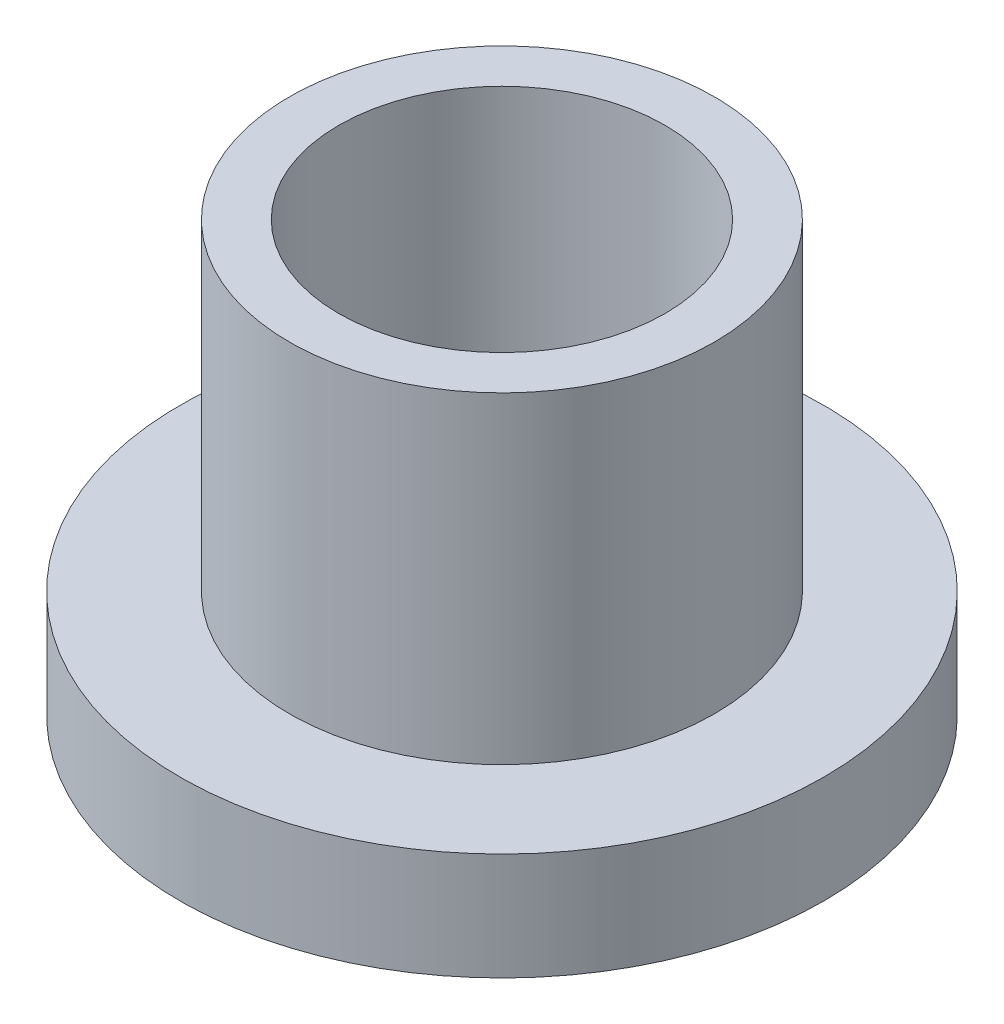
ISO-10303-21;
HEADER;
FILE_DESCRIPTION(('STEP AP214'),'2;1');
FILE_NAME('part.step','',(''),(''),'','','');
FILE_SCHEMA(('AUTOMOTIVE_DESIGN { 1 0 10303 214 1 1 1 1 }'));
ENDSEC;
DATA;
#1=APPLICATION_CONTEXT('core data for automotive mechanical design processes');
#2=APPLICATION_PROTOCOL_DEFINITION('international standard','automotive_design',2000,#1);
#3=PRODUCT_CONTEXT('',#1,'mechanical');
#4=PRODUCT('Part','Part','',(#3));
#5=PRODUCT_RELATED_PRODUCT_CATEGORY('part','',(#4));
#6=PRODUCT_DEFINITION_FORMATION('','',#4);
#7=PRODUCT_DEFINITION_CONTEXT('part definition',#1,'design');
#8=PRODUCT_DEFINITION('design','',#6,#7);
#9=PRODUCT_DEFINITION_SHAPE('','',#8);
#10=(LENGTH_UNIT() NAMED_UNIT(*) SI_UNIT(.MILLI.,.METRE.));
#11=(NAMED_UNIT(*) PLANE_ANGLE_UNIT() SI_UNIT($,.RADIAN.));
#12=(NAMED_UNIT(*) SI_UNIT($,.STERADIAN.) SOLID_ANGLE_UNIT());
#13=UNCERTAINTY_MEASURE_WITH_UNIT(LENGTH_MEASURE(1.E-05),#10,'distance_accuracy_value','');
#14=(GEOMETRIC_REPRESENTATION_CONTEXT(3) GLOBAL_UNCERTAINTY_ASSIGNED_CONTEXT((#13)) GLOBAL_UNIT_ASSIGNED_CONTEXT((#10,
#11,#12)) REPRESENTATION_CONTEXT('',''));
#15=CARTESIAN_POINT('',(0.,0.,0.));
#16=DIRECTION('',(0.,0.,1.));
#17=DIRECTION('',(1.,0.,0.));
#18=AXIS2_PLACEMENT_3D('',#15,#16,#17);
#19=CARTESIAN_POINT('',(-19.05,0.,0.));
#20=DIRECTION('',(0.,1.,0.));
#21=DIRECTION('',(-1.,0.,0.));
#22=AXIS2_PLACEMENT_3D('',#19,#20,#21);
#23=PLANE('',#22);
#24=CARTESIAN_POINT('',(0.,0.,0.));
#25=DIRECTION('',(0.,-1.,0.));
#26=DIRECTION('',(1.,0.,0.));
#27=AXIS2_PLACEMENT_3D('',#24,#25,#26);
#28=CIRCLE('',#27,9.652);
#29=CARTESIAN_POINT('',(9.652,0.,0.));
#30=VERTEX_POINT('',#29);
#31=EDGE_CURVE('E12',#30,#30,#28,.T.);
#32=ORIENTED_EDGE('',*,*,#31,.F.);
#33=EDGE_LOOP('',(#32));
#34=FACE_BOUND('',#33,.T.);
#35=CARTESIAN_POINT('',(0.,0.,0.));
#36=DIRECTION('',(0.,-1.,0.));
#37=DIRECTION('',(1.,0.,0.));
#38=AXIS2_PLACEMENT_3D('',#35,#36,#37);
#39=CIRCLE('',#38,19.05);
#40=CARTESIAN_POINT('',(19.05,1.30596106758596E-13,0.));
#41=VERTEX_POINT('',#40);
#42=EDGE_CURVE('E73',#41,#41,#39,.T.);
#43=ORIENTED_EDGE('',*,*,#42,.T.);
#44=EDGE_LOOP('',(#43));
#45=FACE_BOUND('',#44,.T.);
#46=ADVANCED_FACE('F51',(#34,#45),#23,.F.);
#47=CARTESIAN_POINT('',(0.,0.,0.));
#48=DIRECTION('',(0.,-1.,0.));
#49=DIRECTION('',(1.,0.,0.));
#50=AXIS2_PLACEMENT_3D('',#47,#48,#49);
#51=CYLINDRICAL_SURFACE('',#50,9.65199999999996);
#52=CARTESIAN_POINT('',(0.,25.4,0.));
#53=DIRECTION('',(0.,-1.,0.));
#54=DIRECTION('',(1.,0.,0.));
#55=AXIS2_PLACEMENT_3D('',#52,#53,#54);
#56=CIRCLE('',#55,9.65199999999991);
#57=CARTESIAN_POINT('',(9.65199999999983,25.4000000000001,0.));
#58=VERTEX_POINT('',#57);
#59=EDGE_CURVE('E57',#58,#58,#56,.T.);
#60=ORIENTED_EDGE('',*,*,#59,.F.);
#61=EDGE_LOOP('',(#60));
#62=FACE_BOUND('',#61,.T.);
#63=ORIENTED_EDGE('',*,*,#31,.T.);
#64=EDGE_LOOP('',(#63));
#65=FACE_BOUND('',#64,.T.);
#66=ADVANCED_FACE('F98',(#62,#65),#51,.F.);
#67=CARTESIAN_POINT('',(-9.652,25.4,0.));
#68=DIRECTION('',(0.,-1.,0.));
#69=DIRECTION('',(1.,0.,0.));
#70=AXIS2_PLACEMENT_3D('',#67,#68,#69);
#71=PLANE('',#70);
#72=CARTESIAN_POINT('',(0.,25.4,0.));
#73=DIRECTION('',(0.,-1.,0.));
#74=DIRECTION('',(1.,0.,0.));
#75=AXIS2_PLACEMENT_3D('',#72,#73,#74);
#76=CIRCLE('',#75,12.5729999999999);
#77=CARTESIAN_POINT('',(12.5729999999998,25.4000000000001,0.));
#78=VERTEX_POINT('',#77);
#79=EDGE_CURVE('E61',#78,#78,#76,.T.);
#80=ORIENTED_EDGE('',*,*,#79,.F.);
#81=EDGE_LOOP('',(#80));
#82=FACE_BOUND('',#81,.T.);
#83=ORIENTED_EDGE('',*,*,#59,.T.);
#84=EDGE_LOOP('',(#83));
#85=FACE_BOUND('',#84,.T.);
#86=ADVANCED_FACE('F93',(#82,#85),#71,.F.);
#87=CARTESIAN_POINT('',(0.,0.,0.));
#88=DIRECTION('',(0.,-1.,0.));
#89=DIRECTION('',(1.,0.,0.));
#90=AXIS2_PLACEMENT_3D('',#87,#88,#89);
#91=CYLINDRICAL_SURFACE('',#90,12.5729999999999);
#92=CARTESIAN_POINT('',(0.,6.35000000000004,0.));
#93=DIRECTION('',(0.,-1.,0.));
#94=DIRECTION('',(1.,0.,0.));
#95=AXIS2_PLACEMENT_3D('',#92,#93,#94);
#96=CIRCLE('',#95,12.573);
#97=CARTESIAN_POINT('',(12.573,6.35000000000009,0.));
#98=VERTEX_POINT('',#97);
#99=EDGE_CURVE('E65',#98,#98,#96,.T.);
#100=ORIENTED_EDGE('',*,*,#99,.F.);
#101=EDGE_LOOP('',(#100));
#102=FACE_BOUND('',#101,.T.);
#103=ORIENTED_EDGE('',*,*,#79,.T.);
#104=EDGE_LOOP('',(#103));
#105=FACE_BOUND('',#104,.T.);
#106=ADVANCED_FACE('F87',(#102,#105),#91,.T.);
#107=CARTESIAN_POINT('',(-12.573,6.35000000000001,0.));
#108=DIRECTION('',(0.,-1.,0.));
#109=DIRECTION('',(1.,0.,0.));
#110=AXIS2_PLACEMENT_3D('',#107,#108,#109);
#111=PLANE('',#110);
#112=CARTESIAN_POINT('',(0.,6.35000000000006,0.));
#113=DIRECTION('',(0.,-1.,0.));
#114=DIRECTION('',(1.,0.,0.));
#115=AXIS2_PLACEMENT_3D('',#112,#113,#114);
#116=CIRCLE('',#115,19.05);
#117=CARTESIAN_POINT('',(19.05,6.35000000000013,0.));
#118=VERTEX_POINT('',#117);
#119=EDGE_CURVE('E70',#118,#118,#116,.T.);
#120=ORIENTED_EDGE('',*,*,#119,.F.);
#121=EDGE_LOOP('',(#120));
#122=FACE_BOUND('',#121,.T.);
#123=ORIENTED_EDGE('',*,*,#99,.T.);
#124=EDGE_LOOP('',(#123));
#125=FACE_BOUND('',#124,.T.);
#126=ADVANCED_FACE('F81',(#122,#125),#111,.F.);
#127=CARTESIAN_POINT('',(0.,0.,0.));
#128=DIRECTION('',(0.,-1.,0.));
#129=DIRECTION('',(1.,0.,0.));
#130=AXIS2_PLACEMENT_3D('',#127,#128,#129);
#131=CYLINDRICAL_SURFACE('',#130,19.05);
#132=ORIENTED_EDGE('',*,*,#42,.F.);
#133=EDGE_LOOP('',(#132));
#134=FACE_BOUND('',#133,.T.);
#135=ORIENTED_EDGE('',*,*,#119,.T.);
#136=EDGE_LOOP('',(#135));
#137=FACE_BOUND('',#136,.T.);
#138=ADVANCED_FACE('F78',(#134,#137),#131,.T.);
#139=CLOSED_SHELL('',(#46,#66,#86,#106,#126,#138));
#140=MANIFOLD_SOLID_BREP('B2',#139);
#141=ADVANCED_BREP_SHAPE_REPRESENTATION('',(#18,#140),#14);
#142=SHAPE_DEFINITION_REPRESENTATION(#9,#141);
ENDSEC;
END-ISO-10303-21;
